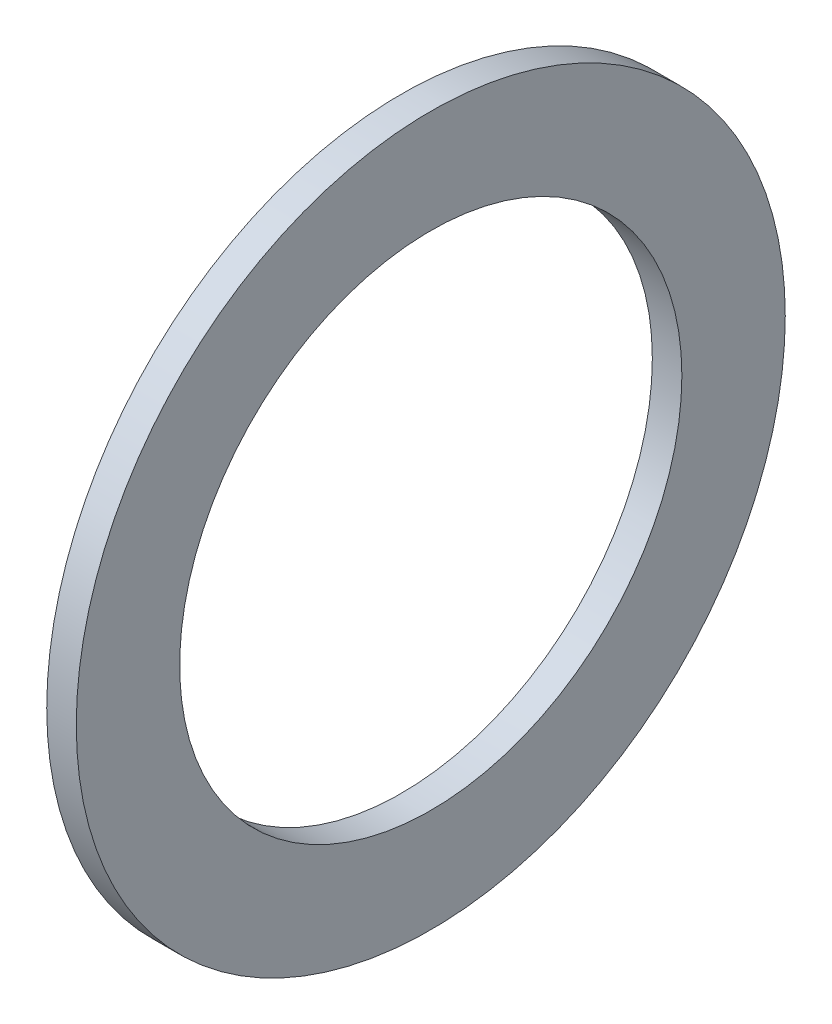
ISO-10303-21;
HEADER;
FILE_DESCRIPTION(('STEP AP214'),'2;1');
FILE_NAME('part.step','',(''),(''),'','','');
FILE_SCHEMA(('AUTOMOTIVE_DESIGN { 1 0 10303 214 1 1 1 1 }'));
ENDSEC;
DATA;
#1=APPLICATION_CONTEXT('core data for automotive mechanical design processes');
#2=APPLICATION_PROTOCOL_DEFINITION('international standard','automotive_design',2000,#1);
#3=PRODUCT_CONTEXT('',#1,'mechanical');
#4=PRODUCT('Part','Part','',(#3));
#5=PRODUCT_RELATED_PRODUCT_CATEGORY('part','',(#4));
#6=PRODUCT_DEFINITION_FORMATION('','',#4);
#7=PRODUCT_DEFINITION_CONTEXT('part definition',#1,'design');
#8=PRODUCT_DEFINITION('design','',#6,#7);
#9=PRODUCT_DEFINITION_SHAPE('','',#8);
#10=(LENGTH_UNIT() NAMED_UNIT(*) SI_UNIT(.MILLI.,.METRE.));
#11=(NAMED_UNIT(*) PLANE_ANGLE_UNIT() SI_UNIT($,.RADIAN.));
#12=(NAMED_UNIT(*) SI_UNIT($,.STERADIAN.) SOLID_ANGLE_UNIT());
#13=UNCERTAINTY_MEASURE_WITH_UNIT(LENGTH_MEASURE(1.E-05),#10,'distance_accuracy_value','');
#14=(GEOMETRIC_REPRESENTATION_CONTEXT(3) GLOBAL_UNCERTAINTY_ASSIGNED_CONTEXT((#13)) GLOBAL_UNIT_ASSIGNED_CONTEXT((#10,
#11,#12)) REPRESENTATION_CONTEXT('',''));
#15=CARTESIAN_POINT('',(0.,0.,0.));
#16=DIRECTION('',(0.,0.,1.));
#17=DIRECTION('',(1.,0.,0.));
#18=AXIS2_PLACEMENT_3D('',#15,#16,#17);
#19=CARTESIAN_POINT('',(1.,0.,0.));
#20=DIRECTION('',(1.,0.,0.));
#21=DIRECTION('',(0.,0.,-1.));
#22=AXIS2_PLACEMENT_3D('',#19,#20,#21);
#23=PLANE('',#22);
#24=CARTESIAN_POINT('',(1.,0.,0.));
#25=DIRECTION('',(1.,0.,0.));
#26=DIRECTION('',(0.,0.,-1.));
#27=AXIS2_PLACEMENT_3D('',#24,#25,#26);
#28=CIRCLE('',#27,12.);
#29=CARTESIAN_POINT('',(1.,0.,-12.));
#30=VERTEX_POINT('',#29);
#31=EDGE_CURVE('E10',#30,#30,#28,.T.);
#32=ORIENTED_EDGE('',*,*,#31,.T.);
#33=EDGE_LOOP('',(#32));
#34=FACE_BOUND('',#33,.T.);
#35=CARTESIAN_POINT('',(1.,0.,0.));
#36=DIRECTION('',(1.,0.,0.));
#37=DIRECTION('',(0.,0.,-1.));
#38=AXIS2_PLACEMENT_3D('',#35,#36,#37);
#39=CIRCLE('',#38,8.5);
#40=CARTESIAN_POINT('',(1.,0.,-8.5));
#41=VERTEX_POINT('',#40);
#42=EDGE_CURVE('E46',#41,#41,#39,.T.);
#43=ORIENTED_EDGE('',*,*,#42,.F.);
#44=EDGE_LOOP('',(#43));
#45=FACE_BOUND('',#44,.T.);
#46=ADVANCED_FACE('F35',(#34,#45),#23,.T.);
#47=CARTESIAN_POINT('',(0.,0.,0.));
#48=DIRECTION('',(1.,0.,0.));
#49=DIRECTION('',(0.,0.,-1.));
#50=AXIS2_PLACEMENT_3D('',#47,#48,#49);
#51=PLANE('',#50);
#52=CARTESIAN_POINT('',(0.,0.,0.));
#53=DIRECTION('',(1.,0.,0.));
#54=DIRECTION('',(0.,0.,-1.));
#55=AXIS2_PLACEMENT_3D('',#52,#53,#54);
#56=CIRCLE('',#55,12.);
#57=CARTESIAN_POINT('',(0.,0.,-12.));
#58=VERTEX_POINT('',#57);
#59=EDGE_CURVE('E39',#58,#58,#56,.T.);
#60=ORIENTED_EDGE('',*,*,#59,.F.);
#61=EDGE_LOOP('',(#60));
#62=FACE_BOUND('',#61,.T.);
#63=CARTESIAN_POINT('',(0.,0.,0.));
#64=DIRECTION('',(1.,0.,0.));
#65=DIRECTION('',(0.,0.,-1.));
#66=AXIS2_PLACEMENT_3D('',#63,#64,#65);
#67=CIRCLE('',#66,8.5);
#68=CARTESIAN_POINT('',(0.,0.,-8.5));
#69=VERTEX_POINT('',#68);
#70=EDGE_CURVE('E48',#69,#69,#67,.T.);
#71=ORIENTED_EDGE('',*,*,#70,.T.);
#72=EDGE_LOOP('',(#71));
#73=FACE_BOUND('',#72,.T.);
#74=ADVANCED_FACE('F58',(#62,#73),#51,.F.);
#75=CARTESIAN_POINT('',(1.,0.,0.));
#76=DIRECTION('',(-1.,0.,0.));
#77=DIRECTION('',(0.,0.,1.));
#78=AXIS2_PLACEMENT_3D('',#75,#76,#77);
#79=CYLINDRICAL_SURFACE('',#78,12.);
#80=ORIENTED_EDGE('',*,*,#31,.F.);
#81=EDGE_LOOP('',(#80));
#82=FACE_BOUND('',#81,.T.);
#83=ORIENTED_EDGE('',*,*,#59,.T.);
#84=EDGE_LOOP('',(#83));
#85=FACE_BOUND('',#84,.T.);
#86=ADVANCED_FACE('F37',(#82,#85),#79,.T.);
#87=CARTESIAN_POINT('',(1.,0.,0.));
#88=DIRECTION('',(-1.,0.,0.));
#89=DIRECTION('',(0.,0.,1.));
#90=AXIS2_PLACEMENT_3D('',#87,#88,#89);
#91=CYLINDRICAL_SURFACE('',#90,8.5);
#92=ORIENTED_EDGE('',*,*,#42,.T.);
#93=EDGE_LOOP('',(#92));
#94=FACE_BOUND('',#93,.T.);
#95=ORIENTED_EDGE('',*,*,#70,.F.);
#96=EDGE_LOOP('',(#95));
#97=FACE_BOUND('',#96,.T.);
#98=ADVANCED_FACE('F54',(#94,#97),#91,.F.);
#99=CLOSED_SHELL('',(#46,#74,#86,#98));
#100=MANIFOLD_SOLID_BREP('B2',#99);
#101=ADVANCED_BREP_SHAPE_REPRESENTATION('',(#18,#100),#14);
#102=SHAPE_DEFINITION_REPRESENTATION(#9,#101);
ENDSEC;
END-ISO-10303-21;
